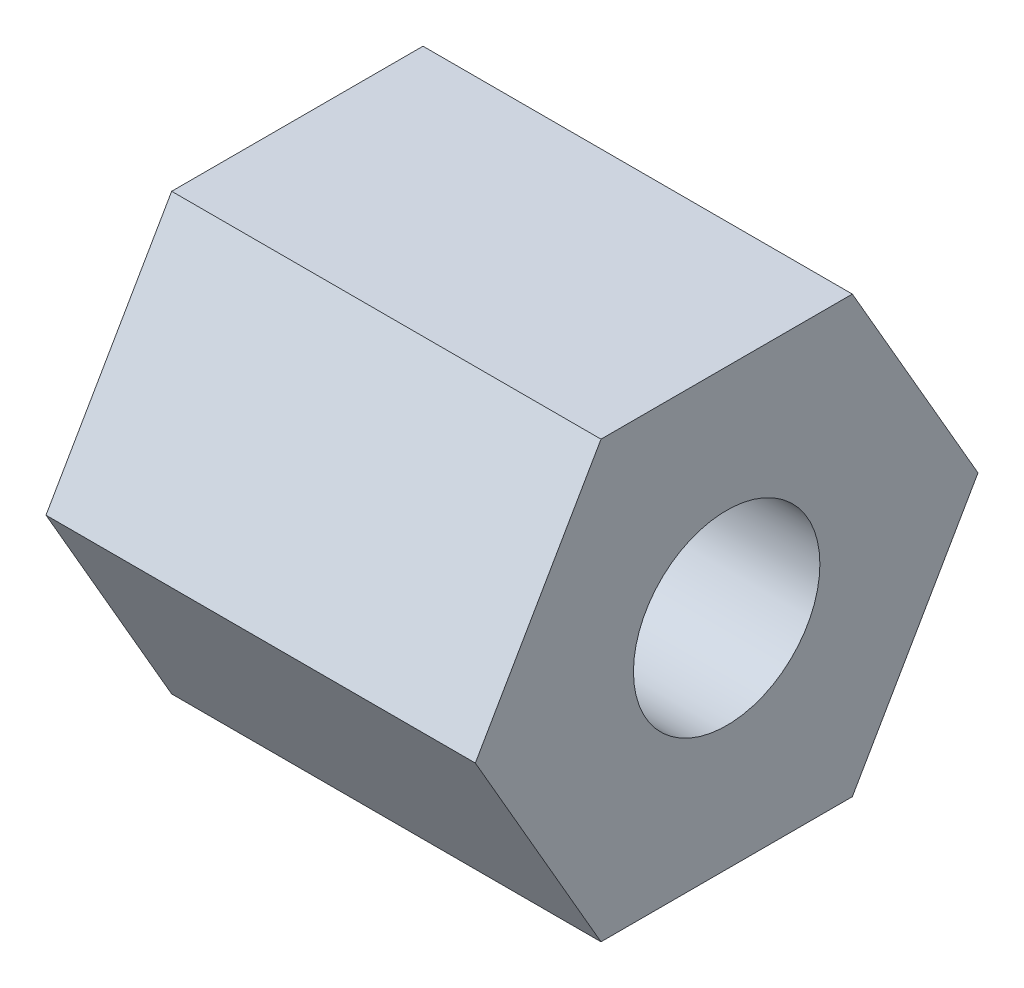
ISO-10303-21;
HEADER;
FILE_DESCRIPTION(('STEP AP214'),'2;1');
FILE_NAME('part.step','',(''),(''),'','','');
FILE_SCHEMA(('AUTOMOTIVE_DESIGN { 1 0 10303 214 1 1 1 1 }'));
ENDSEC;
DATA;
#1=APPLICATION_CONTEXT('core data for automotive mechanical design processes');
#2=APPLICATION_PROTOCOL_DEFINITION('international standard','automotive_design',2000,#1);
#3=PRODUCT_CONTEXT('',#1,'mechanical');
#4=PRODUCT('Part','Part','',(#3));
#5=PRODUCT_RELATED_PRODUCT_CATEGORY('part','',(#4));
#6=PRODUCT_DEFINITION_FORMATION('','',#4);
#7=PRODUCT_DEFINITION_CONTEXT('part definition',#1,'design');
#8=PRODUCT_DEFINITION('design','',#6,#7);
#9=PRODUCT_DEFINITION_SHAPE('','',#8);
#10=(LENGTH_UNIT() NAMED_UNIT(*) SI_UNIT(.MILLI.,.METRE.));
#11=(NAMED_UNIT(*) PLANE_ANGLE_UNIT() SI_UNIT($,.RADIAN.));
#12=(NAMED_UNIT(*) SI_UNIT($,.STERADIAN.) SOLID_ANGLE_UNIT());
#13=UNCERTAINTY_MEASURE_WITH_UNIT(LENGTH_MEASURE(1.E-05),#10,'distance_accuracy_value','');
#14=(GEOMETRIC_REPRESENTATION_CONTEXT(3) GLOBAL_UNCERTAINTY_ASSIGNED_CONTEXT((#13)) GLOBAL_UNIT_ASSIGNED_CONTEXT((#10,
#11,#12)) REPRESENTATION_CONTEXT('',''));
#15=CARTESIAN_POINT('',(0.,0.,0.));
#16=DIRECTION('',(0.,0.,1.));
#17=DIRECTION('',(1.,0.,0.));
#18=AXIS2_PLACEMENT_3D('',#15,#16,#17);
#19=CARTESIAN_POINT('',(5.03,-2.54999999999998,-1.47224318643357));
#20=DIRECTION('',(0.,0.499999999999995,0.866025403784442));
#21=DIRECTION('',(0.,-0.866025403784442,0.499999999999995));
#22=AXIS2_PLACEMENT_3D('',#19,#20,#21);
#23=PLANE('',#22);
#24=DIRECTION('',(0.,0.866025403784442,-0.499999999999995));
#25=VECTOR('',#24,1.);
#26=CARTESIAN_POINT('',(0.,-2.54999999999998,-1.47224318643357));
#27=LINE('',#26,#25);
#28=CARTESIAN_POINT('',(0.,-2.54999999999998,-1.47224318643357));
#29=VERTEX_POINT('',#28);
#30=CARTESIAN_POINT('',(0.,0.,-2.94448637286709));
#31=VERTEX_POINT('',#30);
#32=EDGE_CURVE('E128',#29,#31,#27,.T.);
#33=ORIENTED_EDGE('',*,*,#32,.T.);
#34=DIRECTION('',(-1.,0.,0.));
#35=VECTOR('',#34,1.);
#36=CARTESIAN_POINT('',(5.03,0.,-2.94448637286709));
#37=LINE('',#36,#35);
#38=CARTESIAN_POINT('',(5.03,0.,-2.94448637286709));
#39=VERTEX_POINT('',#38);
#40=EDGE_CURVE('E11',#39,#31,#37,.T.);
#41=ORIENTED_EDGE('',*,*,#40,.F.);
#42=DIRECTION('',(0.,0.866025403784442,-0.499999999999995));
#43=VECTOR('',#42,1.);
#44=CARTESIAN_POINT('',(5.03,-2.54999999999998,-1.47224318643357));
#45=LINE('',#44,#43);
#46=CARTESIAN_POINT('',(5.03,-2.54999999999998,-1.47224318643357));
#47=VERTEX_POINT('',#46);
#48=EDGE_CURVE('E145',#47,#39,#45,.T.);
#49=ORIENTED_EDGE('',*,*,#48,.F.);
#50=DIRECTION('',(-1.,0.,0.));
#51=VECTOR('',#50,1.);
#52=CARTESIAN_POINT('',(5.03,-2.54999999999998,-1.47224318643357));
#53=LINE('',#52,#51);
#54=EDGE_CURVE('E124',#47,#29,#53,.T.);
#55=ORIENTED_EDGE('',*,*,#54,.T.);
#56=EDGE_LOOP('',(#33,#41,#49,#55));
#57=FACE_BOUND('',#56,.T.);
#58=ADVANCED_FACE('F39',(#57),#23,.F.);
#59=CARTESIAN_POINT('',(5.03,0.,-2.94448637286709));
#60=DIRECTION('',(0.,-0.500000000000001,0.866025403784438));
#61=DIRECTION('',(0.,-0.866025403784438,-0.500000000000001));
#62=AXIS2_PLACEMENT_3D('',#59,#60,#61);
#63=PLANE('',#62);
#64=DIRECTION('',(0.,0.866025403784438,0.500000000000001));
#65=VECTOR('',#64,1.);
#66=CARTESIAN_POINT('',(0.,0.,-2.94448637286709));
#67=LINE('',#66,#65);
#68=CARTESIAN_POINT('',(0.,2.55,-1.47224318643354));
#69=VERTEX_POINT('',#68);
#70=EDGE_CURVE('E132',#31,#69,#67,.T.);
#71=ORIENTED_EDGE('',*,*,#70,.T.);
#72=DIRECTION('',(-1.,0.,0.));
#73=VECTOR('',#72,1.);
#74=CARTESIAN_POINT('',(5.03,2.55,-1.47224318643354));
#75=LINE('',#74,#73);
#76=CARTESIAN_POINT('',(5.03,2.55,-1.47224318643354));
#77=VERTEX_POINT('',#76);
#78=EDGE_CURVE('E48',#77,#69,#75,.T.);
#79=ORIENTED_EDGE('',*,*,#78,.F.);
#80=DIRECTION('',(0.,0.866025403784438,0.500000000000001));
#81=VECTOR('',#80,1.);
#82=CARTESIAN_POINT('',(5.03,0.,-2.94448637286709));
#83=LINE('',#82,#81);
#84=EDGE_CURVE('E93',#39,#77,#83,.T.);
#85=ORIENTED_EDGE('',*,*,#84,.F.);
#86=ORIENTED_EDGE('',*,*,#40,.T.);
#87=EDGE_LOOP('',(#71,#79,#85,#86));
#88=FACE_BOUND('',#87,.T.);
#89=ADVANCED_FACE('F174',(#88),#63,.F.);
#90=CARTESIAN_POINT('',(5.03,2.55,-1.47224318643354));
#91=DIRECTION('',(0.,-1.,0.));
#92=DIRECTION('',(0.,0.,-1.));
#93=AXIS2_PLACEMENT_3D('',#90,#91,#92);
#94=PLANE('',#93);
#95=DIRECTION('',(0.,0.,1.));
#96=VECTOR('',#95,1.);
#97=CARTESIAN_POINT('',(0.,2.55,-1.47224318643354));
#98=LINE('',#97,#96);
#99=CARTESIAN_POINT('',(0.,2.54999999999999,1.47224318643356));
#100=VERTEX_POINT('',#99);
#101=EDGE_CURVE('E136',#69,#100,#98,.T.);
#102=ORIENTED_EDGE('',*,*,#101,.T.);
#103=DIRECTION('',(-1.,0.,0.));
#104=VECTOR('',#103,1.);
#105=CARTESIAN_POINT('',(5.03,2.54999999999999,1.47224318643356));
#106=LINE('',#105,#104);
#107=CARTESIAN_POINT('',(5.03,2.54999999999999,1.47224318643356));
#108=VERTEX_POINT('',#107);
#109=EDGE_CURVE('E117',#108,#100,#106,.T.);
#110=ORIENTED_EDGE('',*,*,#109,.F.);
#111=DIRECTION('',(0.,0.,1.));
#112=VECTOR('',#111,1.);
#113=CARTESIAN_POINT('',(5.03,2.55,-1.47224318643354));
#114=LINE('',#113,#112);
#115=EDGE_CURVE('E106',#77,#108,#114,.T.);
#116=ORIENTED_EDGE('',*,*,#115,.F.);
#117=ORIENTED_EDGE('',*,*,#78,.T.);
#118=EDGE_LOOP('',(#102,#110,#116,#117));
#119=FACE_BOUND('',#118,.T.);
#120=ADVANCED_FACE('F155',(#119),#94,.F.);
#121=CARTESIAN_POINT('',(5.03,2.54999999999999,1.47224318643356));
#122=DIRECTION('',(0.,-0.499999999999995,-0.866025403784442));
#123=DIRECTION('',(0.,0.866025403784442,-0.499999999999995));
#124=AXIS2_PLACEMENT_3D('',#121,#122,#123);
#125=PLANE('',#124);
#126=DIRECTION('',(0.,-0.866025403784442,0.499999999999995));
#127=VECTOR('',#126,1.);
#128=CARTESIAN_POINT('',(0.,2.54999999999999,1.47224318643356));
#129=LINE('',#128,#127);
#130=CARTESIAN_POINT('',(0.,0.,2.94448637286709));
#131=VERTEX_POINT('',#130);
#132=EDGE_CURVE('E115',#100,#131,#129,.T.);
#133=ORIENTED_EDGE('',*,*,#132,.T.);
#134=DIRECTION('',(-1.,0.,0.));
#135=VECTOR('',#134,1.);
#136=CARTESIAN_POINT('',(5.03,0.,2.94448637286709));
#137=LINE('',#136,#135);
#138=CARTESIAN_POINT('',(5.03,0.,2.94448637286709));
#139=VERTEX_POINT('',#138);
#140=EDGE_CURVE('E112',#139,#131,#137,.T.);
#141=ORIENTED_EDGE('',*,*,#140,.F.);
#142=DIRECTION('',(0.,-0.866025403784442,0.499999999999995));
#143=VECTOR('',#142,1.);
#144=CARTESIAN_POINT('',(5.03,2.54999999999999,1.47224318643356));
#145=LINE('',#144,#143);
#146=EDGE_CURVE('E100',#108,#139,#145,.T.);
#147=ORIENTED_EDGE('',*,*,#146,.F.);
#148=ORIENTED_EDGE('',*,*,#109,.T.);
#149=EDGE_LOOP('',(#133,#141,#147,#148));
#150=FACE_BOUND('',#149,.T.);
#151=ADVANCED_FACE('F113',(#150),#125,.F.);
#152=CARTESIAN_POINT('',(5.03,0.,2.94448637286709));
#153=DIRECTION('',(0.,0.500000000000007,-0.866025403784435));
#154=DIRECTION('',(0.,0.866025403784435,0.500000000000007));
#155=AXIS2_PLACEMENT_3D('',#152,#153,#154);
#156=PLANE('',#155);
#157=DIRECTION('',(0.,-0.866025403784435,-0.500000000000007));
#158=VECTOR('',#157,1.);
#159=CARTESIAN_POINT('',(0.,0.,2.94448637286709));
#160=LINE('',#159,#158);
#161=CARTESIAN_POINT('',(0.,-2.55000000000001,1.47224318643352));
#162=VERTEX_POINT('',#161);
#163=EDGE_CURVE('E79',#131,#162,#160,.T.);
#164=ORIENTED_EDGE('',*,*,#163,.T.);
#165=DIRECTION('',(-1.,0.,0.));
#166=VECTOR('',#165,1.);
#167=CARTESIAN_POINT('',(5.03,-2.55000000000001,1.47224318643352));
#168=LINE('',#167,#166);
#169=CARTESIAN_POINT('',(5.03,-2.55000000000001,1.47224318643352));
#170=VERTEX_POINT('',#169);
#171=EDGE_CURVE('E118',#170,#162,#168,.T.);
#172=ORIENTED_EDGE('',*,*,#171,.F.);
#173=DIRECTION('',(0.,-0.866025403784435,-0.500000000000007));
#174=VECTOR('',#173,1.);
#175=CARTESIAN_POINT('',(5.03,0.,2.94448637286709));
#176=LINE('',#175,#174);
#177=EDGE_CURVE('E104',#139,#170,#176,.T.);
#178=ORIENTED_EDGE('',*,*,#177,.F.);
#179=ORIENTED_EDGE('',*,*,#140,.T.);
#180=EDGE_LOOP('',(#164,#172,#178,#179));
#181=FACE_BOUND('',#180,.T.);
#182=ADVANCED_FACE('F120',(#181),#156,.F.);
#183=CARTESIAN_POINT('',(5.03,-2.55000000000001,1.47224318643352));
#184=DIRECTION('',(0.,1.,0.));
#185=DIRECTION('',(0.,0.,1.));
#186=AXIS2_PLACEMENT_3D('',#183,#184,#185);
#187=PLANE('',#186);
#188=DIRECTION('',(0.,0.,-1.));
#189=VECTOR('',#188,1.);
#190=CARTESIAN_POINT('',(0.,-2.55000000000001,1.47224318643352));
#191=LINE('',#190,#189);
#192=EDGE_CURVE('E85',#162,#29,#191,.T.);
#193=ORIENTED_EDGE('',*,*,#192,.T.);
#194=ORIENTED_EDGE('',*,*,#54,.F.);
#195=DIRECTION('',(0.,0.,-1.));
#196=VECTOR('',#195,1.);
#197=CARTESIAN_POINT('',(5.03,-2.55000000000001,1.47224318643352));
#198=LINE('',#197,#196);
#199=EDGE_CURVE('E56',#170,#47,#198,.T.);
#200=ORIENTED_EDGE('',*,*,#199,.F.);
#201=ORIENTED_EDGE('',*,*,#171,.T.);
#202=EDGE_LOOP('',(#193,#194,#200,#201));
#203=FACE_BOUND('',#202,.T.);
#204=ADVANCED_FACE('F162',(#203),#187,.F.);
#205=CARTESIAN_POINT('',(5.03,0.,0.));
#206=DIRECTION('',(1.,0.,0.));
#207=DIRECTION('',(0.,0.,-1.));
#208=AXIS2_PLACEMENT_3D('',#205,#206,#207);
#209=PLANE('',#208);
#210=CARTESIAN_POINT('',(5.03,0.,0.));
#211=DIRECTION('',(1.,0.,0.));
#212=DIRECTION('',(0.,0.,-1.));
#213=AXIS2_PLACEMENT_3D('',#210,#211,#212);
#214=CIRCLE('',#213,1.0922);
#215=CARTESIAN_POINT('',(5.03,0.,-1.0922));
#216=VERTEX_POINT('',#215);
#217=EDGE_CURVE('E229',#216,#216,#214,.T.);
#218=ORIENTED_EDGE('',*,*,#217,.F.);
#219=EDGE_LOOP('',(#218));
#220=FACE_BOUND('',#219,.T.);
#221=ORIENTED_EDGE('',*,*,#48,.T.);
#222=ORIENTED_EDGE('',*,*,#84,.T.);
#223=ORIENTED_EDGE('',*,*,#115,.T.);
#224=ORIENTED_EDGE('',*,*,#146,.T.);
#225=ORIENTED_EDGE('',*,*,#177,.T.);
#226=ORIENTED_EDGE('',*,*,#199,.T.);
#227=EDGE_LOOP('',(#221,#222,#223,#224,#225,#226));
#228=FACE_BOUND('',#227,.T.);
#229=ADVANCED_FACE('F102',(#220,#228),#209,.T.);
#230=CARTESIAN_POINT('',(0.,0.,0.));
#231=DIRECTION('',(1.,0.,0.));
#232=DIRECTION('',(0.,0.,-1.));
#233=AXIS2_PLACEMENT_3D('',#230,#231,#232);
#234=PLANE('',#233);
#235=CARTESIAN_POINT('',(0.,0.,0.));
#236=DIRECTION('',(1.,0.,0.));
#237=DIRECTION('',(0.,0.,-1.));
#238=AXIS2_PLACEMENT_3D('',#235,#236,#237);
#239=CIRCLE('',#238,1.0922);
#240=CARTESIAN_POINT('',(0.,0.,-1.0922));
#241=VERTEX_POINT('',#240);
#242=EDGE_CURVE('E133',#241,#241,#239,.T.);
#243=ORIENTED_EDGE('',*,*,#242,.T.);
#244=EDGE_LOOP('',(#243));
#245=FACE_BOUND('',#244,.T.);
#246=ORIENTED_EDGE('',*,*,#32,.F.);
#247=ORIENTED_EDGE('',*,*,#192,.F.);
#248=ORIENTED_EDGE('',*,*,#163,.F.);
#249=ORIENTED_EDGE('',*,*,#132,.F.);
#250=ORIENTED_EDGE('',*,*,#101,.F.);
#251=ORIENTED_EDGE('',*,*,#70,.F.);
#252=EDGE_LOOP('',(#246,#247,#248,#249,#250,#251));
#253=FACE_BOUND('',#252,.T.);
#254=ADVANCED_FACE('F158',(#245,#253),#234,.F.);
#255=CARTESIAN_POINT('',(0.,0.,0.));
#256=DIRECTION('',(1.,0.,0.));
#257=DIRECTION('',(0.,0.,-1.));
#258=AXIS2_PLACEMENT_3D('',#255,#256,#257);
#259=CYLINDRICAL_SURFACE('',#258,1.0922);
#260=ORIENTED_EDGE('',*,*,#242,.F.);
#261=EDGE_LOOP('',(#260));
#262=FACE_BOUND('',#261,.T.);
#263=ORIENTED_EDGE('',*,*,#217,.T.);
#264=EDGE_LOOP('',(#263));
#265=FACE_BOUND('',#264,.T.);
#266=ADVANCED_FACE('F211',(#262,#265),#259,.F.);
#267=CLOSED_SHELL('',(#58,#89,#120,#151,#182,#204,#229,#254,#266));
#268=MANIFOLD_SOLID_BREP('B2',#267);
#269=ADVANCED_BREP_SHAPE_REPRESENTATION('',(#18,#268),#14);
#270=SHAPE_DEFINITION_REPRESENTATION(#9,#269);
ENDSEC;
END-ISO-10303-21;
